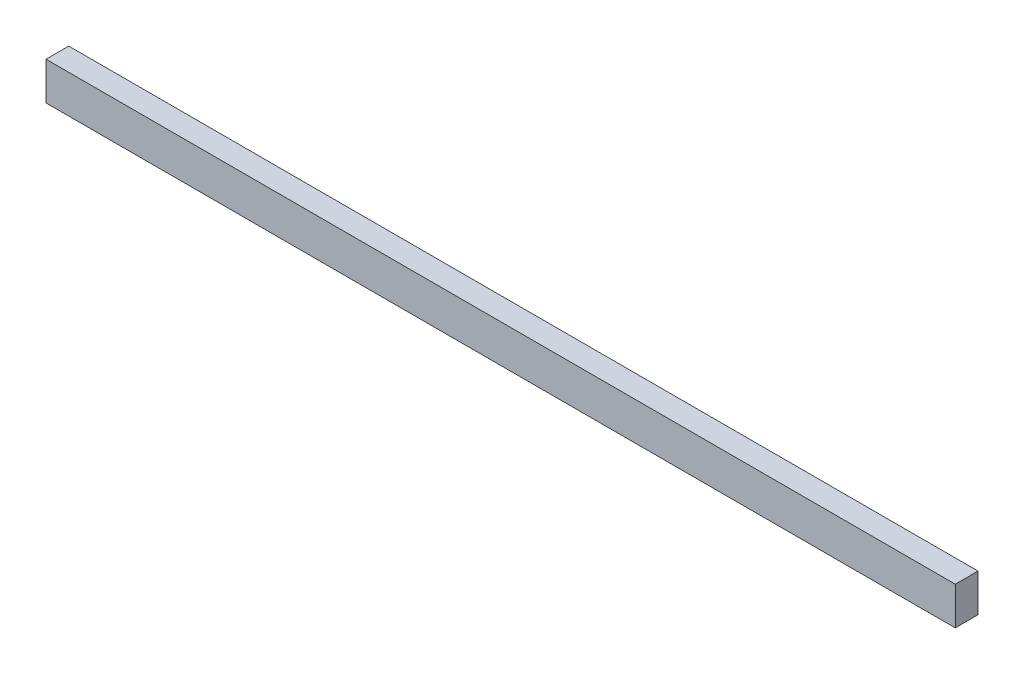
ISO-10303-21;
HEADER;
FILE_DESCRIPTION(('STEP AP214'),'2;1');
FILE_NAME('part.step','',(''),(''),'','','');
FILE_SCHEMA(('AUTOMOTIVE_DESIGN { 1 0 10303 214 1 1 1 1 }'));
ENDSEC;
DATA;
#1=APPLICATION_CONTEXT('core data for automotive mechanical design processes');
#2=APPLICATION_PROTOCOL_DEFINITION('international standard','automotive_design',2000,#1);
#3=PRODUCT_CONTEXT('',#1,'mechanical');
#4=PRODUCT('Part','Part','',(#3));
#5=PRODUCT_RELATED_PRODUCT_CATEGORY('part','',(#4));
#6=PRODUCT_DEFINITION_FORMATION('','',#4);
#7=PRODUCT_DEFINITION_CONTEXT('part definition',#1,'design');
#8=PRODUCT_DEFINITION('design','',#6,#7);
#9=PRODUCT_DEFINITION_SHAPE('','',#8);
#10=(LENGTH_UNIT() NAMED_UNIT(*) SI_UNIT(.MILLI.,.METRE.));
#11=(NAMED_UNIT(*) PLANE_ANGLE_UNIT() SI_UNIT($,.RADIAN.));
#12=(NAMED_UNIT(*) SI_UNIT($,.STERADIAN.) SOLID_ANGLE_UNIT());
#13=UNCERTAINTY_MEASURE_WITH_UNIT(LENGTH_MEASURE(1.E-05),#10,'distance_accuracy_value','');
#14=(GEOMETRIC_REPRESENTATION_CONTEXT(3) GLOBAL_UNCERTAINTY_ASSIGNED_CONTEXT((#13)) GLOBAL_UNIT_ASSIGNED_CONTEXT((#10,
#11,#12)) REPRESENTATION_CONTEXT('',''));
#15=CARTESIAN_POINT('',(0.,0.,0.));
#16=DIRECTION('',(0.,0.,1.));
#17=DIRECTION('',(1.,0.,0.));
#18=AXIS2_PLACEMENT_3D('',#15,#16,#17);
#19=CARTESIAN_POINT('',(0.,0.,6.));
#20=DIRECTION('',(0.,0.,1.));
#21=DIRECTION('',(1.,0.,0.));
#22=AXIS2_PLACEMENT_3D('',#19,#20,#21);
#23=PLANE('',#22);
#24=DIRECTION('',(-1.,0.,0.));
#25=VECTOR('',#24,1.);
#26=CARTESIAN_POINT('',(0.,-5.,6.));
#27=LINE('',#26,#25);
#28=CARTESIAN_POINT('',(120.,-5.,6.));
#29=VERTEX_POINT('',#28);
#30=CARTESIAN_POINT('',(-120.,-5.,6.));
#31=VERTEX_POINT('',#30);
#32=EDGE_CURVE('E11',#29,#31,#27,.T.);
#33=ORIENTED_EDGE('',*,*,#32,.F.);
#34=DIRECTION('',(0.,-1.,0.));
#35=VECTOR('',#34,1.);
#36=CARTESIAN_POINT('',(120.,0.,6.));
#37=LINE('',#36,#35);
#38=CARTESIAN_POINT('',(120.,5.,6.));
#39=VERTEX_POINT('',#38);
#40=EDGE_CURVE('E62',#39,#29,#37,.T.);
#41=ORIENTED_EDGE('',*,*,#40,.F.);
#42=DIRECTION('',(1.,0.,0.));
#43=VECTOR('',#42,1.);
#44=CARTESIAN_POINT('',(0.,5.,6.));
#45=LINE('',#44,#43);
#46=CARTESIAN_POINT('',(-120.,5.,6.));
#47=VERTEX_POINT('',#46);
#48=EDGE_CURVE('E99',#47,#39,#45,.T.);
#49=ORIENTED_EDGE('',*,*,#48,.F.);
#50=DIRECTION('',(0.,1.,0.));
#51=VECTOR('',#50,1.);
#52=CARTESIAN_POINT('',(-120.,0.,6.));
#53=LINE('',#52,#51);
#54=EDGE_CURVE('E25',#31,#47,#53,.T.);
#55=ORIENTED_EDGE('',*,*,#54,.F.);
#56=EDGE_LOOP('',(#33,#41,#49,#55));
#57=FACE_BOUND('',#56,.T.);
#58=ADVANCED_FACE('F17',(#57),#23,.T.);
#59=CARTESIAN_POINT('',(0.,-5.,0.));
#60=DIRECTION('',(0.,-1.,0.));
#61=DIRECTION('',(0.,0.,-1.));
#62=AXIS2_PLACEMENT_3D('',#59,#60,#61);
#63=PLANE('',#62);
#64=DIRECTION('',(0.,0.,1.));
#65=VECTOR('',#64,1.);
#66=CARTESIAN_POINT('',(120.,-5.,0.));
#67=LINE('',#66,#65);
#68=CARTESIAN_POINT('',(120.,-5.,0.));
#69=VERTEX_POINT('',#68);
#70=EDGE_CURVE('E55',#69,#29,#67,.T.);
#71=ORIENTED_EDGE('',*,*,#70,.T.);
#72=ORIENTED_EDGE('',*,*,#32,.T.);
#73=DIRECTION('',(0.,0.,1.));
#74=VECTOR('',#73,1.);
#75=CARTESIAN_POINT('',(-120.,-5.,0.));
#76=LINE('',#75,#74);
#77=CARTESIAN_POINT('',(-120.,-5.,0.));
#78=VERTEX_POINT('',#77);
#79=EDGE_CURVE('E69',#78,#31,#76,.T.);
#80=ORIENTED_EDGE('',*,*,#79,.F.);
#81=DIRECTION('',(1.,0.,0.));
#82=VECTOR('',#81,1.);
#83=CARTESIAN_POINT('',(0.,-5.,0.));
#84=LINE('',#83,#82);
#85=EDGE_CURVE('E67',#78,#69,#84,.T.);
#86=ORIENTED_EDGE('',*,*,#85,.T.);
#87=EDGE_LOOP('',(#71,#72,#80,#86));
#88=FACE_BOUND('',#87,.T.);
#89=ADVANCED_FACE('F68',(#88),#63,.T.);
#90=CARTESIAN_POINT('',(-120.,0.,0.));
#91=DIRECTION('',(-1.,0.,0.));
#92=DIRECTION('',(0.,0.,1.));
#93=AXIS2_PLACEMENT_3D('',#90,#91,#92);
#94=PLANE('',#93);
#95=ORIENTED_EDGE('',*,*,#79,.T.);
#96=ORIENTED_EDGE('',*,*,#54,.T.);
#97=DIRECTION('',(0.,0.,1.));
#98=VECTOR('',#97,1.);
#99=CARTESIAN_POINT('',(-120.,5.,0.));
#100=LINE('',#99,#98);
#101=CARTESIAN_POINT('',(-120.,5.,0.));
#102=VERTEX_POINT('',#101);
#103=EDGE_CURVE('E91',#102,#47,#100,.T.);
#104=ORIENTED_EDGE('',*,*,#103,.F.);
#105=DIRECTION('',(0.,-1.,0.));
#106=VECTOR('',#105,1.);
#107=CARTESIAN_POINT('',(-120.,0.,0.));
#108=LINE('',#107,#106);
#109=EDGE_CURVE('E74',#102,#78,#108,.T.);
#110=ORIENTED_EDGE('',*,*,#109,.T.);
#111=EDGE_LOOP('',(#95,#96,#104,#110));
#112=FACE_BOUND('',#111,.T.);
#113=ADVANCED_FACE('F106',(#112),#94,.T.);
#114=CARTESIAN_POINT('',(0.,5.,0.));
#115=DIRECTION('',(0.,1.,0.));
#116=DIRECTION('',(0.,0.,1.));
#117=AXIS2_PLACEMENT_3D('',#114,#115,#116);
#118=PLANE('',#117);
#119=ORIENTED_EDGE('',*,*,#103,.T.);
#120=ORIENTED_EDGE('',*,*,#48,.T.);
#121=DIRECTION('',(0.,0.,1.));
#122=VECTOR('',#121,1.);
#123=CARTESIAN_POINT('',(120.,5.,0.));
#124=LINE('',#123,#122);
#125=CARTESIAN_POINT('',(120.,5.,0.));
#126=VERTEX_POINT('',#125);
#127=EDGE_CURVE('E64',#126,#39,#124,.T.);
#128=ORIENTED_EDGE('',*,*,#127,.F.);
#129=DIRECTION('',(-1.,0.,0.));
#130=VECTOR('',#129,1.);
#131=CARTESIAN_POINT('',(0.,5.,0.));
#132=LINE('',#131,#130);
#133=EDGE_CURVE('E79',#126,#102,#132,.T.);
#134=ORIENTED_EDGE('',*,*,#133,.T.);
#135=EDGE_LOOP('',(#119,#120,#128,#134));
#136=FACE_BOUND('',#135,.T.);
#137=ADVANCED_FACE('F104',(#136),#118,.T.);
#138=CARTESIAN_POINT('',(0.,0.,0.));
#139=DIRECTION('',(0.,0.,-1.));
#140=DIRECTION('',(-1.,0.,0.));
#141=AXIS2_PLACEMENT_3D('',#138,#139,#140);
#142=PLANE('',#141);
#143=DIRECTION('',(0.,1.,0.));
#144=VECTOR('',#143,1.);
#145=CARTESIAN_POINT('',(120.,0.,0.));
#146=LINE('',#145,#144);
#147=EDGE_CURVE('E60',#69,#126,#146,.T.);
#148=ORIENTED_EDGE('',*,*,#147,.F.);
#149=ORIENTED_EDGE('',*,*,#85,.F.);
#150=ORIENTED_EDGE('',*,*,#109,.F.);
#151=ORIENTED_EDGE('',*,*,#133,.F.);
#152=EDGE_LOOP('',(#148,#149,#150,#151));
#153=FACE_BOUND('',#152,.T.);
#154=ADVANCED_FACE('F77',(#153),#142,.T.);
#155=CARTESIAN_POINT('',(120.,0.,0.));
#156=DIRECTION('',(1.,0.,0.));
#157=DIRECTION('',(0.,0.,-1.));
#158=AXIS2_PLACEMENT_3D('',#155,#156,#157);
#159=PLANE('',#158);
#160=ORIENTED_EDGE('',*,*,#147,.T.);
#161=ORIENTED_EDGE('',*,*,#127,.T.);
#162=ORIENTED_EDGE('',*,*,#40,.T.);
#163=ORIENTED_EDGE('',*,*,#70,.F.);
#164=EDGE_LOOP('',(#160,#161,#162,#163));
#165=FACE_BOUND('',#164,.T.);
#166=ADVANCED_FACE('F57',(#165),#159,.T.);
#167=CLOSED_SHELL('',(#58,#89,#113,#137,#154,#166));
#168=MANIFOLD_SOLID_BREP('B1',#167);
#169=ADVANCED_BREP_SHAPE_REPRESENTATION('',(#18,#168),#14);
#170=SHAPE_DEFINITION_REPRESENTATION(#9,#169);
ENDSEC;
END-ISO-10303-21;
